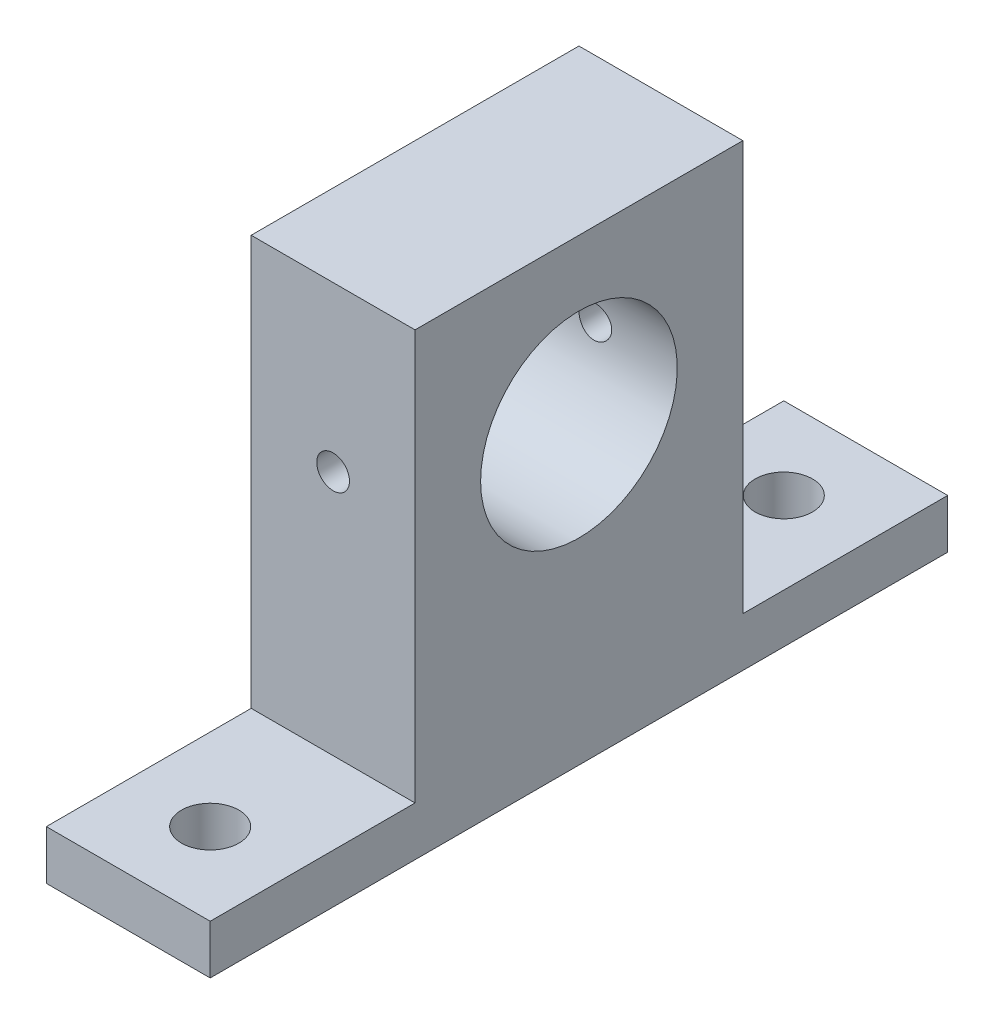
ISO-10303-21;
HEADER;
FILE_DESCRIPTION(('STEP AP214'),'2;1');
FILE_NAME('part.step','',(''),(''),'','','');
FILE_SCHEMA(('AUTOMOTIVE_DESIGN { 1 0 10303 214 1 1 1 1 }'));
ENDSEC;
DATA;
#1=APPLICATION_CONTEXT('core data for automotive mechanical design processes');
#2=APPLICATION_PROTOCOL_DEFINITION('international standard','automotive_design',2000,#1);
#3=PRODUCT_CONTEXT('',#1,'mechanical');
#4=PRODUCT('Part','Part','',(#3));
#5=PRODUCT_RELATED_PRODUCT_CATEGORY('part','',(#4));
#6=PRODUCT_DEFINITION_FORMATION('','',#4);
#7=PRODUCT_DEFINITION_CONTEXT('part definition',#1,'design');
#8=PRODUCT_DEFINITION('design','',#6,#7);
#9=PRODUCT_DEFINITION_SHAPE('','',#8);
#10=(LENGTH_UNIT() NAMED_UNIT(*) SI_UNIT(.MILLI.,.METRE.));
#11=(NAMED_UNIT(*) PLANE_ANGLE_UNIT() SI_UNIT($,.RADIAN.));
#12=(NAMED_UNIT(*) SI_UNIT($,.STERADIAN.) SOLID_ANGLE_UNIT());
#13=UNCERTAINTY_MEASURE_WITH_UNIT(LENGTH_MEASURE(1.E-05),#10,'distance_accuracy_value','');
#14=(GEOMETRIC_REPRESENTATION_CONTEXT(3) GLOBAL_UNCERTAINTY_ASSIGNED_CONTEXT((#13)) GLOBAL_UNIT_ASSIGNED_CONTEXT((#10,
#11,#12)) REPRESENTATION_CONTEXT('',''));
#15=CARTESIAN_POINT('',(0.,0.,0.));
#16=DIRECTION('',(0.,0.,1.));
#17=DIRECTION('',(1.,0.,0.));
#18=AXIS2_PLACEMENT_3D('',#15,#16,#17);
#19=CARTESIAN_POINT('',(0.,3.,0.));
#20=DIRECTION('',(0.,1.,0.));
#21=DIRECTION('',(0.,0.,1.));
#22=AXIS2_PLACEMENT_3D('',#19,#20,#21);
#23=PLANE('',#22);
#24=DIRECTION('',(1.,0.,0.));
#25=VECTOR('',#24,1.);
#26=CARTESIAN_POINT('',(-5.,3.,10.));
#27=LINE('',#26,#25);
#28=CARTESIAN_POINT('',(-5.,3.,9.99999999999999));
#29=VERTEX_POINT('',#28);
#30=CARTESIAN_POINT('',(5.,3.,9.99999999999999));
#31=VERTEX_POINT('',#30);
#32=EDGE_CURVE('E68',#29,#31,#27,.T.);
#33=ORIENTED_EDGE('',*,*,#32,.F.);
#34=DIRECTION('',(0.,0.,1.));
#35=VECTOR('',#34,1.);
#36=CARTESIAN_POINT('',(-5.,3.,-22.5));
#37=LINE('',#36,#35);
#38=CARTESIAN_POINT('',(-5.,3.,22.5));
#39=VERTEX_POINT('',#38);
#40=EDGE_CURVE('E173',#29,#39,#37,.T.);
#41=ORIENTED_EDGE('',*,*,#40,.T.);
#42=DIRECTION('',(1.,0.,0.));
#43=VECTOR('',#42,1.);
#44=CARTESIAN_POINT('',(-5.,3.,22.5));
#45=LINE('',#44,#43);
#46=CARTESIAN_POINT('',(5.,3.,22.5));
#47=VERTEX_POINT('',#46);
#48=EDGE_CURVE('E177',#39,#47,#45,.T.);
#49=ORIENTED_EDGE('',*,*,#48,.T.);
#50=DIRECTION('',(0.,0.,-1.));
#51=VECTOR('',#50,1.);
#52=CARTESIAN_POINT('',(5.,3.,-22.5));
#53=LINE('',#52,#51);
#54=EDGE_CURVE('E167',#47,#31,#53,.T.);
#55=ORIENTED_EDGE('',*,*,#54,.T.);
#56=EDGE_LOOP('',(#33,#41,#49,#55));
#57=FACE_BOUND('',#56,.T.);
#58=CARTESIAN_POINT('',(4.88807387438039E-13,3.,17.5));
#59=DIRECTION('',(0.,1.,0.));
#60=DIRECTION('',(0.,0.,1.));
#61=AXIS2_PLACEMENT_3D('',#58,#59,#60);
#62=CIRCLE('',#61,1.75);
#63=CARTESIAN_POINT('',(4.88807387438039E-13,3.,19.25));
#64=VERTEX_POINT('',#63);
#65=EDGE_CURVE('E149',#64,#64,#62,.T.);
#66=ORIENTED_EDGE('',*,*,#65,.F.);
#67=EDGE_LOOP('',(#66));
#68=FACE_BOUND('',#67,.T.);
#69=ADVANCED_FACE('F45',(#57,#68),#23,.T.);
#70=DIRECTION('',(-1.,0.,0.));
#71=VECTOR('',#70,1.);
#72=CARTESIAN_POINT('',(-5.,3.,-10.));
#73=LINE('',#72,#71);
#74=CARTESIAN_POINT('',(5.,3.,-10.));
#75=VERTEX_POINT('',#74);
#76=CARTESIAN_POINT('',(-5.,3.,-10.));
#77=VERTEX_POINT('',#76);
#78=EDGE_CURVE('E76',#75,#77,#73,.T.);
#79=ORIENTED_EDGE('',*,*,#78,.F.);
#80=CARTESIAN_POINT('',(5.,3.,-22.5));
#81=VERTEX_POINT('',#80);
#82=EDGE_CURVE('E142',#75,#81,#53,.T.);
#83=ORIENTED_EDGE('',*,*,#82,.T.);
#84=DIRECTION('',(-1.,0.,0.));
#85=VECTOR('',#84,1.);
#86=CARTESIAN_POINT('',(-5.,3.,-22.5));
#87=LINE('',#86,#85);
#88=CARTESIAN_POINT('',(-5.,3.,-22.5));
#89=VERTEX_POINT('',#88);
#90=EDGE_CURVE('E170',#81,#89,#87,.T.);
#91=ORIENTED_EDGE('',*,*,#90,.T.);
#92=EDGE_CURVE('E174',#89,#77,#37,.T.);
#93=ORIENTED_EDGE('',*,*,#92,.T.);
#94=EDGE_LOOP('',(#79,#83,#91,#93));
#95=FACE_BOUND('',#94,.T.);
#96=CARTESIAN_POINT('',(0.,3.,-17.5));
#97=DIRECTION('',(0.,1.,0.));
#98=DIRECTION('',(0.,0.,1.));
#99=AXIS2_PLACEMENT_3D('',#96,#97,#98);
#100=CIRCLE('',#99,1.75);
#101=CARTESIAN_POINT('',(0.,3.,-15.75));
#102=VERTEX_POINT('',#101);
#103=EDGE_CURVE('E159',#102,#102,#100,.T.);
#104=ORIENTED_EDGE('',*,*,#103,.F.);
#105=EDGE_LOOP('',(#104));
#106=FACE_BOUND('',#105,.T.);
#107=ADVANCED_FACE('F224',(#95,#106),#23,.T.);
#108=CARTESIAN_POINT('',(0.,0.,0.));
#109=DIRECTION('',(0.,1.,0.));
#110=DIRECTION('',(0.,0.,1.));
#111=AXIS2_PLACEMENT_3D('',#108,#109,#110);
#112=PLANE('',#111);
#113=DIRECTION('',(0.,0.,-1.));
#114=VECTOR('',#113,1.);
#115=CARTESIAN_POINT('',(5.,0.,-22.5));
#116=LINE('',#115,#114);
#117=CARTESIAN_POINT('',(5.,0.,22.5));
#118=VERTEX_POINT('',#117);
#119=CARTESIAN_POINT('',(5.,0.,-22.5));
#120=VERTEX_POINT('',#119);
#121=EDGE_CURVE('E163',#118,#120,#116,.T.);
#122=ORIENTED_EDGE('',*,*,#121,.F.);
#123=DIRECTION('',(1.,0.,0.));
#124=VECTOR('',#123,1.);
#125=CARTESIAN_POINT('',(-5.,0.,22.5));
#126=LINE('',#125,#124);
#127=CARTESIAN_POINT('',(-5.,0.,22.5));
#128=VERTEX_POINT('',#127);
#129=EDGE_CURVE('E189',#128,#118,#126,.T.);
#130=ORIENTED_EDGE('',*,*,#129,.F.);
#131=DIRECTION('',(0.,0.,1.));
#132=VECTOR('',#131,1.);
#133=CARTESIAN_POINT('',(-5.,0.,-22.5));
#134=LINE('',#133,#132);
#135=CARTESIAN_POINT('',(-5.,0.,-22.5));
#136=VERTEX_POINT('',#135);
#137=EDGE_CURVE('E186',#136,#128,#134,.T.);
#138=ORIENTED_EDGE('',*,*,#137,.F.);
#139=DIRECTION('',(-1.,0.,0.));
#140=VECTOR('',#139,1.);
#141=CARTESIAN_POINT('',(-5.,0.,-22.5));
#142=LINE('',#141,#140);
#143=EDGE_CURVE('E183',#120,#136,#142,.T.);
#144=ORIENTED_EDGE('',*,*,#143,.F.);
#145=EDGE_LOOP('',(#122,#130,#138,#144));
#146=FACE_BOUND('',#145,.T.);
#147=CARTESIAN_POINT('',(0.,0.,-17.5));
#148=DIRECTION('',(0.,1.,0.));
#149=DIRECTION('',(0.,0.,1.));
#150=AXIS2_PLACEMENT_3D('',#147,#148,#149);
#151=CIRCLE('',#150,1.75);
#152=CARTESIAN_POINT('',(0.,0.,-15.75));
#153=VERTEX_POINT('',#152);
#154=EDGE_CURVE('E157',#153,#153,#151,.T.);
#155=ORIENTED_EDGE('',*,*,#154,.T.);
#156=EDGE_LOOP('',(#155));
#157=FACE_BOUND('',#156,.T.);
#158=CARTESIAN_POINT('',(4.88807387438039E-13,0.,17.5));
#159=DIRECTION('',(0.,1.,0.));
#160=DIRECTION('',(0.,0.,1.));
#161=AXIS2_PLACEMENT_3D('',#158,#159,#160);
#162=CIRCLE('',#161,1.75);
#163=CARTESIAN_POINT('',(4.88807387438039E-13,0.,19.25));
#164=VERTEX_POINT('',#163);
#165=EDGE_CURVE('E144',#164,#164,#162,.T.);
#166=ORIENTED_EDGE('',*,*,#165,.T.);
#167=EDGE_LOOP('',(#166));
#168=FACE_BOUND('',#167,.T.);
#169=ADVANCED_FACE('F229',(#146,#157,#168),#112,.F.);
#170=CARTESIAN_POINT('',(5.,3.,-22.5));
#171=DIRECTION('',(-1.,0.,0.));
#172=DIRECTION('',(0.,0.,1.));
#173=AXIS2_PLACEMENT_3D('',#170,#171,#172);
#174=PLANE('',#173);
#175=CARTESIAN_POINT('',(5.,18.,0.));
#176=DIRECTION('',(-1.,0.,0.));
#177=DIRECTION('',(0.,0.,1.));
#178=AXIS2_PLACEMENT_3D('',#175,#176,#177);
#179=CIRCLE('',#178,6.);
#180=CARTESIAN_POINT('',(5.,18.,6.));
#181=VERTEX_POINT('',#180);
#182=EDGE_CURVE('E272',#181,#181,#179,.T.);
#183=ORIENTED_EDGE('',*,*,#182,.T.);
#184=EDGE_LOOP('',(#183));
#185=FACE_BOUND('',#184,.T.);
#186=ORIENTED_EDGE('',*,*,#121,.T.);
#187=DIRECTION('',(0.,-1.,0.));
#188=VECTOR('',#187,1.);
#189=CARTESIAN_POINT('',(5.,3.,-22.5));
#190=LINE('',#189,#188);
#191=EDGE_CURVE('E11',#81,#120,#190,.T.);
#192=ORIENTED_EDGE('',*,*,#191,.F.);
#193=ORIENTED_EDGE('',*,*,#82,.F.);
#194=DIRECTION('',(0.,-1.,0.));
#195=VECTOR('',#194,1.);
#196=CARTESIAN_POINT('',(5.,28.,-10.));
#197=LINE('',#196,#195);
#198=CARTESIAN_POINT('',(5.,28.,-10.));
#199=VERTEX_POINT('',#198);
#200=EDGE_CURVE('E122',#199,#75,#197,.T.);
#201=ORIENTED_EDGE('',*,*,#200,.F.);
#202=DIRECTION('',(0.,0.,-1.));
#203=VECTOR('',#202,1.);
#204=CARTESIAN_POINT('',(5.,28.,-10.));
#205=LINE('',#204,#203);
#206=CARTESIAN_POINT('',(5.,28.,10.));
#207=VERTEX_POINT('',#206);
#208=EDGE_CURVE('E129',#207,#199,#205,.T.);
#209=ORIENTED_EDGE('',*,*,#208,.F.);
#210=DIRECTION('',(0.,-1.,0.));
#211=VECTOR('',#210,1.);
#212=CARTESIAN_POINT('',(5.,28.,10.));
#213=LINE('',#212,#211);
#214=EDGE_CURVE('E264',#207,#31,#213,.T.);
#215=ORIENTED_EDGE('',*,*,#214,.T.);
#216=ORIENTED_EDGE('',*,*,#54,.F.);
#217=DIRECTION('',(0.,-1.,0.));
#218=VECTOR('',#217,1.);
#219=CARTESIAN_POINT('',(5.,3.,22.5));
#220=LINE('',#219,#218);
#221=EDGE_CURVE('E180',#47,#118,#220,.T.);
#222=ORIENTED_EDGE('',*,*,#221,.T.);
#223=EDGE_LOOP('',(#186,#192,#193,#201,#209,#215,#216,#222));
#224=FACE_BOUND('',#223,.T.);
#225=ADVANCED_FACE('F47',(#185,#224),#174,.F.);
#226=CARTESIAN_POINT('',(-5.,3.,-22.5));
#227=DIRECTION('',(0.,0.,1.));
#228=DIRECTION('',(1.,0.,0.));
#229=AXIS2_PLACEMENT_3D('',#226,#227,#228);
#230=PLANE('',#229);
#231=ORIENTED_EDGE('',*,*,#143,.T.);
#232=DIRECTION('',(0.,-1.,0.));
#233=VECTOR('',#232,1.);
#234=CARTESIAN_POINT('',(-5.,3.,-22.5));
#235=LINE('',#234,#233);
#236=EDGE_CURVE('E60',#89,#136,#235,.T.);
#237=ORIENTED_EDGE('',*,*,#236,.F.);
#238=ORIENTED_EDGE('',*,*,#90,.F.);
#239=ORIENTED_EDGE('',*,*,#191,.T.);
#240=EDGE_LOOP('',(#231,#237,#238,#239));
#241=FACE_BOUND('',#240,.T.);
#242=ADVANCED_FACE('F244',(#241),#230,.F.);
#243=CARTESIAN_POINT('',(-5.,3.,-22.5));
#244=DIRECTION('',(1.,0.,0.));
#245=DIRECTION('',(0.,0.,-1.));
#246=AXIS2_PLACEMENT_3D('',#243,#244,#245);
#247=PLANE('',#246);
#248=CARTESIAN_POINT('',(-5.,18.,0.));
#249=DIRECTION('',(-1.,0.,0.));
#250=DIRECTION('',(0.,0.,1.));
#251=AXIS2_PLACEMENT_3D('',#248,#249,#250);
#252=CIRCLE('',#251,6.);
#253=CARTESIAN_POINT('',(-5.,18.,6.));
#254=VERTEX_POINT('',#253);
#255=EDGE_CURVE('E282',#254,#254,#252,.T.);
#256=ORIENTED_EDGE('',*,*,#255,.F.);
#257=EDGE_LOOP('',(#256));
#258=FACE_BOUND('',#257,.T.);
#259=ORIENTED_EDGE('',*,*,#137,.T.);
#260=DIRECTION('',(0.,-1.,0.));
#261=VECTOR('',#260,1.);
#262=CARTESIAN_POINT('',(-5.,3.,22.5));
#263=LINE('',#262,#261);
#264=EDGE_CURVE('E195',#39,#128,#263,.T.);
#265=ORIENTED_EDGE('',*,*,#264,.F.);
#266=ORIENTED_EDGE('',*,*,#40,.F.);
#267=DIRECTION('',(0.,-1.,0.));
#268=VECTOR('',#267,1.);
#269=CARTESIAN_POINT('',(-5.,28.,10.));
#270=LINE('',#269,#268);
#271=CARTESIAN_POINT('',(-5.,28.,10.));
#272=VERTEX_POINT('',#271);
#273=EDGE_CURVE('E151',#272,#29,#270,.T.);
#274=ORIENTED_EDGE('',*,*,#273,.F.);
#275=DIRECTION('',(0.,0.,1.));
#276=VECTOR('',#275,1.);
#277=CARTESIAN_POINT('',(-5.,28.,-10.));
#278=LINE('',#277,#276);
#279=CARTESIAN_POINT('',(-5.,28.,-10.));
#280=VERTEX_POINT('',#279);
#281=EDGE_CURVE('E128',#280,#272,#278,.T.);
#282=ORIENTED_EDGE('',*,*,#281,.F.);
#283=DIRECTION('',(0.,-1.,0.));
#284=VECTOR('',#283,1.);
#285=CARTESIAN_POINT('',(-5.,28.,-10.));
#286=LINE('',#285,#284);
#287=EDGE_CURVE('E124',#280,#77,#286,.T.);
#288=ORIENTED_EDGE('',*,*,#287,.T.);
#289=ORIENTED_EDGE('',*,*,#92,.F.);
#290=ORIENTED_EDGE('',*,*,#236,.T.);
#291=EDGE_LOOP('',(#259,#265,#266,#274,#282,#288,#289,#290));
#292=FACE_BOUND('',#291,.T.);
#293=ADVANCED_FACE('F241',(#258,#292),#247,.F.);
#294=CARTESIAN_POINT('',(-5.,3.,22.5));
#295=DIRECTION('',(0.,0.,-1.));
#296=DIRECTION('',(-1.,0.,0.));
#297=AXIS2_PLACEMENT_3D('',#294,#295,#296);
#298=PLANE('',#297);
#299=ORIENTED_EDGE('',*,*,#129,.T.);
#300=ORIENTED_EDGE('',*,*,#221,.F.);
#301=ORIENTED_EDGE('',*,*,#48,.F.);
#302=ORIENTED_EDGE('',*,*,#264,.T.);
#303=EDGE_LOOP('',(#299,#300,#301,#302));
#304=FACE_BOUND('',#303,.T.);
#305=ADVANCED_FACE('F238',(#304),#298,.F.);
#306=CARTESIAN_POINT('',(0.,3.,-17.5));
#307=DIRECTION('',(0.,-1.,0.));
#308=DIRECTION('',(0.,0.,-1.));
#309=AXIS2_PLACEMENT_3D('',#306,#307,#308);
#310=CYLINDRICAL_SURFACE('',#309,1.75);
#311=ORIENTED_EDGE('',*,*,#103,.T.);
#312=EDGE_LOOP('',(#311));
#313=FACE_BOUND('',#312,.T.);
#314=ORIENTED_EDGE('',*,*,#154,.F.);
#315=EDGE_LOOP('',(#314));
#316=FACE_BOUND('',#315,.T.);
#317=ADVANCED_FACE('F233',(#313,#316),#310,.F.);
#318=CARTESIAN_POINT('',(4.88807387438039E-13,3.,17.5));
#319=DIRECTION('',(0.,-1.,0.));
#320=DIRECTION('',(0.,0.,-1.));
#321=AXIS2_PLACEMENT_3D('',#318,#319,#320);
#322=CYLINDRICAL_SURFACE('',#321,1.75);
#323=ORIENTED_EDGE('',*,*,#65,.T.);
#324=EDGE_LOOP('',(#323));
#325=FACE_BOUND('',#324,.T.);
#326=ORIENTED_EDGE('',*,*,#165,.F.);
#327=EDGE_LOOP('',(#326));
#328=FACE_BOUND('',#327,.T.);
#329=ADVANCED_FACE('F318',(#325,#328),#322,.F.);
#330=CARTESIAN_POINT('',(-5.,28.,-10.));
#331=DIRECTION('',(0.,0.,1.));
#332=DIRECTION('',(1.,0.,0.));
#333=AXIS2_PLACEMENT_3D('',#330,#331,#332);
#334=PLANE('',#333);
#335=CARTESIAN_POINT('',(0.,18.,-10.));
#336=DIRECTION('',(0.,0.,1.));
#337=DIRECTION('',(1.,0.,0.));
#338=AXIS2_PLACEMENT_3D('',#335,#336,#337);
#339=CIRCLE('',#338,1.);
#340=CARTESIAN_POINT('',(1.,18.,-10.));
#341=VERTEX_POINT('',#340);
#342=EDGE_CURVE('E207',#341,#341,#339,.T.);
#343=ORIENTED_EDGE('',*,*,#342,.T.);
#344=EDGE_LOOP('',(#343));
#345=FACE_BOUND('',#344,.T.);
#346=ORIENTED_EDGE('',*,*,#78,.T.);
#347=ORIENTED_EDGE('',*,*,#287,.F.);
#348=DIRECTION('',(-1.,0.,0.));
#349=VECTOR('',#348,1.);
#350=CARTESIAN_POINT('',(-5.,28.,-10.));
#351=LINE('',#350,#349);
#352=EDGE_CURVE('E118',#199,#280,#351,.T.);
#353=ORIENTED_EDGE('',*,*,#352,.F.);
#354=ORIENTED_EDGE('',*,*,#200,.T.);
#355=EDGE_LOOP('',(#346,#347,#353,#354));
#356=FACE_BOUND('',#355,.T.);
#357=ADVANCED_FACE('F120',(#345,#356),#334,.F.);
#358=CARTESIAN_POINT('',(-5.,28.,10.));
#359=DIRECTION('',(0.,0.,-1.));
#360=DIRECTION('',(-1.,0.,0.));
#361=AXIS2_PLACEMENT_3D('',#358,#359,#360);
#362=PLANE('',#361);
#363=CARTESIAN_POINT('',(0.,18.,10.));
#364=DIRECTION('',(0.,0.,1.));
#365=DIRECTION('',(1.,0.,0.));
#366=AXIS2_PLACEMENT_3D('',#363,#364,#365);
#367=CIRCLE('',#366,1.);
#368=CARTESIAN_POINT('',(1.,18.,10.));
#369=VERTEX_POINT('',#368);
#370=EDGE_CURVE('E289',#369,#369,#367,.T.);
#371=ORIENTED_EDGE('',*,*,#370,.F.);
#372=EDGE_LOOP('',(#371));
#373=FACE_BOUND('',#372,.T.);
#374=ORIENTED_EDGE('',*,*,#32,.T.);
#375=ORIENTED_EDGE('',*,*,#214,.F.);
#376=DIRECTION('',(1.,0.,0.));
#377=VECTOR('',#376,1.);
#378=CARTESIAN_POINT('',(-5.,28.,10.));
#379=LINE('',#378,#377);
#380=EDGE_CURVE('E134',#272,#207,#379,.T.);
#381=ORIENTED_EDGE('',*,*,#380,.F.);
#382=ORIENTED_EDGE('',*,*,#273,.T.);
#383=EDGE_LOOP('',(#374,#375,#381,#382));
#384=FACE_BOUND('',#383,.T.);
#385=ADVANCED_FACE('F267',(#373,#384),#362,.F.);
#386=CARTESIAN_POINT('',(0.,28.,0.));
#387=DIRECTION('',(0.,1.,0.));
#388=DIRECTION('',(0.,0.,1.));
#389=AXIS2_PLACEMENT_3D('',#386,#387,#388);
#390=PLANE('',#389);
#391=ORIENTED_EDGE('',*,*,#208,.T.);
#392=ORIENTED_EDGE('',*,*,#352,.T.);
#393=ORIENTED_EDGE('',*,*,#281,.T.);
#394=ORIENTED_EDGE('',*,*,#380,.T.);
#395=EDGE_LOOP('',(#391,#392,#393,#394));
#396=FACE_BOUND('',#395,.T.);
#397=ADVANCED_FACE('F132',(#396),#390,.T.);
#398=CARTESIAN_POINT('',(5.,18.,0.));
#399=DIRECTION('',(-1.,0.,0.));
#400=DIRECTION('',(0.,0.,1.));
#401=AXIS2_PLACEMENT_3D('',#398,#399,#400);
#402=CYLINDRICAL_SURFACE('',#401,6.);
#403=CARTESIAN_POINT('',(1.,18.,6.));
#404=CARTESIAN_POINT('',(0.999997764420874,18.0557563619833,5.9999990446753));
#405=CARTESIAN_POINT('',(0.995321090012433,18.1115431527355,5.99921471165214));
#406=CARTESIAN_POINT('',(0.976745736493871,18.2215520886692,5.99616137976555));
#407=CARTESIAN_POINT('',(0.962838577235359,18.2757727471837,5.99389101569556));
#408=CARTESIAN_POINT('',(0.926233820562898,18.3810418988851,5.9881202729458));
#409=CARTESIAN_POINT('',(0.90354341374377,18.4320929473728,5.98462090063677));
#410=CARTESIAN_POINT('',(0.850035083179042,18.5296567367912,5.97677690832828));
#411=CARTESIAN_POINT('',(0.819218089006802,18.5761699959514,5.97243238501774));
#412=CARTESIAN_POINT('',(0.750017966471818,18.6637890457167,5.96333326983325));
#413=CARTESIAN_POINT('',(0.71157235414555,18.704845161414,5.95857548725943));
#414=CARTESIAN_POINT('',(0.628340812610877,18.779955399464,5.94921050750693));
#415=CARTESIAN_POINT('',(0.583554483417357,18.8140090797564,5.94460331985067));
#416=CARTESIAN_POINT('',(0.488571613521179,18.8743468502421,5.93603026303912));
#417=CARTESIAN_POINT('',(0.438343465278098,18.9005818211444,5.93206851636654));
#418=CARTESIAN_POINT('',(0.33411617427975,18.9442233461645,5.9252791591787));
#419=CARTESIAN_POINT('',(0.280117286528948,18.9616304966262,5.92245147205723));
#420=CARTESIAN_POINT('',(0.170407890057385,18.9869657511139,5.91828214737102));
#421=CARTESIAN_POINT('',(0.114717705399443,18.9949796116542,5.9169270739428));
#422=CARTESIAN_POINT('',(0.00276788924661112,19.001566690116,5.9158157557466));
#423=CARTESIAN_POINT('',(-0.0534917016669202,19.0001405761556,5.91605939782886));
#424=CARTESIAN_POINT('',(-0.16437114451018,18.9879580393585,5.91810571545422));
#425=CARTESIAN_POINT('',(-0.219001921418094,18.9772979527559,5.91989229327567));
#426=CARTESIAN_POINT('',(-0.325688527131654,18.9471012561614,5.92479798084403));
#427=CARTESIAN_POINT('',(-0.377744267555419,18.9275643417279,5.92791713629309));
#428=CARTESIAN_POINT('',(-0.478091529376368,18.8800708984376,5.9351539173364));
#429=CARTESIAN_POINT('',(-0.526363762432492,18.8520743655519,5.9392762684293));
#430=CARTESIAN_POINT('',(-0.617561760215356,18.788484807023,5.94805167366004));
#431=CARTESIAN_POINT('',(-0.660487092981974,18.7528911682617,5.95270477061715));
#432=CARTESIAN_POINT('',(-0.740330434322939,18.6745928848636,5.96208811151914));
#433=CARTESIAN_POINT('',(-0.777167407416033,18.6318055855493,5.96681859692661));
#434=CARTESIAN_POINT('',(-0.843151105066137,18.5406140995927,5.97577040558689));
#435=CARTESIAN_POINT('',(-0.872297780073292,18.4922098767626,5.97999172555898));
#436=CARTESIAN_POINT('',(-0.922080890854514,18.3910823664667,5.98745557157165));
#437=CARTESIAN_POINT('',(-0.942710167732504,18.3383554902259,5.99069727362979));
#438=CARTESIAN_POINT('',(-0.974797686098393,18.2301193382411,5.99583001205064));
#439=CARTESIAN_POINT('',(-0.986256694789488,18.1746102956718,5.9977211614019));
#440=CARTESIAN_POINT('',(-0.999568543384455,18.0630839605207,5.99992451937074));
#441=CARTESIAN_POINT('',(-1.00153262872224,18.0070802948604,6.00025501205114));
#442=CARTESIAN_POINT('',(-0.996095462228751,17.895544090844,5.99934989768468));
#443=CARTESIAN_POINT('',(-0.988694570746506,17.8400115344432,5.99811435089647));
#444=CARTESIAN_POINT('',(-0.964830060265809,17.7313375297813,5.99422730775281));
#445=CARTESIAN_POINT('',(-0.94842151664395,17.6781836526458,5.99158441920524));
#446=CARTESIAN_POINT('',(-0.907066192720187,17.5753812460558,5.98517785782144));
#447=CARTESIAN_POINT('',(-0.882118932945892,17.5257329136361,5.98141412204808));
#448=CARTESIAN_POINT('',(-0.824139550121286,17.4308677242124,5.97313806520963));
#449=CARTESIAN_POINT('',(-0.7910379375331,17.3856938996251,5.96861942354809));
#450=CARTESIAN_POINT('',(-0.717785073845977,17.3015025657989,5.9593538695676));
#451=CARTESIAN_POINT('',(-0.677633310689332,17.2624855041214,5.95460694068619));
#452=CARTESIAN_POINT('',(-0.590920980771429,17.1913028881368,5.94536070094338));
#453=CARTESIAN_POINT('',(-0.544298333794235,17.1592124955545,5.94086446454843));
#454=CARTESIAN_POINT('',(-0.446258812344583,17.103319075882,5.93268611911154));
#455=CARTESIAN_POINT('',(-0.394842089909001,17.0795157860921,5.92900398426408));
#456=CARTESIAN_POINT('',(-0.288884106875147,17.0409846674107,5.92289381479082));
#457=CARTESIAN_POINT('',(-0.234356761987804,17.0262194269808,5.92046061724426));
#458=CARTESIAN_POINT('',(-0.123551948311295,17.0060658184887,5.91711086734104));
#459=CARTESIAN_POINT('',(-0.0672746321071792,17.0006766352215,5.91619418313089));
#460=CARTESIAN_POINT('',(0.0446820663849639,16.9994508535811,5.91598693233605));
#461=CARTESIAN_POINT('',(0.100360151430116,17.0034959455499,5.9166762260226));
#462=CARTESIAN_POINT('',(0.210231699220307,17.0207680644173,5.91955912581491));
#463=CARTESIAN_POINT('',(0.26442516677675,17.033995061555,5.92175272704486));
#464=CARTESIAN_POINT('',(0.369743374917046,17.069210204162,5.92738942512688));
#465=CARTESIAN_POINT('',(0.42087160402241,17.0911881637598,5.93083106887868));
#466=CARTESIAN_POINT('',(0.518734267677939,17.1432691984336,5.93857747568883));
#467=CARTESIAN_POINT('',(0.565468484148854,17.1733726765006,5.9428822815536));
#468=CARTESIAN_POINT('',(0.653814233243102,17.2412724462511,5.95193381618249));
#469=CARTESIAN_POINT('',(0.69535840668011,17.2791557745625,5.95668518230521));
#470=CARTESIAN_POINT('',(0.771540641789975,17.3613563874479,5.96605748944336));
#471=CARTESIAN_POINT('',(0.806177107455269,17.4056751548349,5.97067840010619));
#472=CARTESIAN_POINT('',(0.867779307279979,17.4998523321439,5.97930611856888));
#473=CARTESIAN_POINT('',(0.894690415725181,17.5497468849869,5.98330846501242));
#474=CARTESIAN_POINT('',(0.939707793843969,17.6533947722484,5.9902046704071));
#475=CARTESIAN_POINT('',(0.95782283243188,17.707144202068,5.99309963270993));
#476=CARTESIAN_POINT('',(0.980802109650667,17.8009186759818,5.99682316333182));
#477=CARTESIAN_POINT('',(0.987989787846386,17.8403764678806,5.99800810909344));
#478=CARTESIAN_POINT('',(0.997589495137901,17.9198842758721,5.99959686394448));
#479=CARTESIAN_POINT('',(1.00000160645495,17.9599342817566,6.00000068648257));
#480=CARTESIAN_POINT('',(1.,18.,6.));
#481=B_SPLINE_CURVE_WITH_KNOTS('',3,(#403,#404,#405,#406,#407,#408,#409,#410,#411,#412,#413,
#414,#415,#416,#417,#418,#419,#420,#421,#422,#423,#424,#425,#426,#427,#428,#429,#430,#431,#432,
#433,#434,#435,#436,#437,#438,#439,#440,#441,#442,#443,#444,#445,#446,#447,#448,#449,#450,#451,
#452,#453,#454,#455,#456,#457,#458,#459,#460,#461,#462,#463,#464,#465,#466,#467,#468,#469,#470,
#471,#472,#473,#474,#475,#476,#477,#478,#479,#480),.UNSPECIFIED.,.T.,.F.,(4,2,2,2,2,2,2,2,2,2,2,
2,2,2,2,2,2,2,2,2,2,2,2,2,2,2,2,2,2,2,2,2,2,2,2,2,2,2,4),(0.,0.167122633975403,
0.334399018278169,0.50153874681011,0.668659365069916,0.837209964249327,1.00577120067943,
1.17537008329536,1.34495750750473,1.5129843084137,1.68099921728355,1.84728208704164,
2.01357066010153,2.18065822653023,2.3477592827223,2.51693107964531,2.68610396654339,
2.85541875566362,3.0247193780846,3.19203153396559,3.35933725214344,3.52563122802566,
3.69193454330427,3.8597073025081,4.02749225221714,4.19701528803048,4.36653294950378,
4.53534408936709,4.70414055114647,4.87083163809081,5.03752218475254,5.2040192729049,
5.37052462011735,5.53900553677357,5.7075253355159,5.8772089264288,6.04672300852029,
6.16681699265608,6.28690890910788),.UNSPECIFIED.);
#482=CARTESIAN_POINT('',(1.,18.,6.));
#483=VERTEX_POINT('',#482);
#484=EDGE_CURVE('E49',#483,#483,#481,.T.);
#485=ORIENTED_EDGE('',*,*,#484,.T.);
#486=EDGE_LOOP('',(#485));
#487=FACE_BOUND('',#486,.T.);
#488=CARTESIAN_POINT('',(1.,18.,-6.));
#489=CARTESIAN_POINT('',(0.999997764420874,17.9442436380167,-5.9999990446753));
#490=CARTESIAN_POINT('',(0.995321090012433,17.8884568472645,-5.99921471165214));
#491=CARTESIAN_POINT('',(0.976745736493871,17.7784479113308,-5.99616137976555));
#492=CARTESIAN_POINT('',(0.962838577235359,17.7242272528163,-5.99389101569556));
#493=CARTESIAN_POINT('',(0.926233820562898,17.6189581011149,-5.9881202729458));
#494=CARTESIAN_POINT('',(0.90354341374377,17.5679070526272,-5.98462090063677));
#495=CARTESIAN_POINT('',(0.850035083179041,17.4703432632088,-5.97677690832828));
#496=CARTESIAN_POINT('',(0.819218089006801,17.4238300040486,-5.97243238501774));
#497=CARTESIAN_POINT('',(0.750017966471818,17.3362109542833,-5.96333326983325));
#498=CARTESIAN_POINT('',(0.71157235414555,17.295154838586,-5.95857548725943));
#499=CARTESIAN_POINT('',(0.628340812610877,17.220044600536,-5.94921050750693));
#500=CARTESIAN_POINT('',(0.583554483417357,17.1859909202436,-5.94460331985067));
#501=CARTESIAN_POINT('',(0.488571613521179,17.125653149758,-5.93603026303912));
#502=CARTESIAN_POINT('',(0.438343465278098,17.0994181788556,-5.93206851636655));
#503=CARTESIAN_POINT('',(0.33411617427975,17.0557766538355,-5.9252791591787));
#504=CARTESIAN_POINT('',(0.280117286528948,17.0383695033738,-5.92245147205723));
#505=CARTESIAN_POINT('',(0.170407890057385,17.0130342488861,-5.91828214737102));
#506=CARTESIAN_POINT('',(0.114717705399443,17.0050203883458,-5.9169270739428));
#507=CARTESIAN_POINT('',(0.00276788924661149,16.998433309884,-5.9158157557466));
#508=CARTESIAN_POINT('',(-0.05349170166692,16.9998594238444,-5.91605939782886));
#509=CARTESIAN_POINT('',(-0.16437114451018,17.0120419606415,-5.91810571545422));
#510=CARTESIAN_POINT('',(-0.219001921418093,17.0227020472441,-5.91989229327567));
#511=CARTESIAN_POINT('',(-0.325688527131653,17.0528987438386,-5.92479798084403));
#512=CARTESIAN_POINT('',(-0.377744267555419,17.0724356582721,-5.92791713629309));
#513=CARTESIAN_POINT('',(-0.478091529376368,17.1199291015624,-5.9351539173364));
#514=CARTESIAN_POINT('',(-0.526363762432491,17.1479256344481,-5.9392762684293));
#515=CARTESIAN_POINT('',(-0.617561760215353,17.211515192977,-5.94805167366003));
#516=CARTESIAN_POINT('',(-0.660487092981973,17.2471088317383,-5.95270477061714));
#517=CARTESIAN_POINT('',(-0.740330434322938,17.3254071151364,-5.96208811151914));
#518=CARTESIAN_POINT('',(-0.777167407416033,17.3681944144508,-5.96681859692661));
#519=CARTESIAN_POINT('',(-0.843151105066136,17.4593859004073,-5.97577040558689));
#520=CARTESIAN_POINT('',(-0.872297780073292,17.5077901232374,-5.97999172555898));
#521=CARTESIAN_POINT('',(-0.922080890854514,17.6089176335333,-5.98745557157165));
#522=CARTESIAN_POINT('',(-0.942710167732504,17.6616445097741,-5.99069727362979));
#523=CARTESIAN_POINT('',(-0.974797686098392,17.7698806617589,-5.99583001205064));
#524=CARTESIAN_POINT('',(-0.986256694789488,17.8253897043282,-5.9977211614019));
#525=CARTESIAN_POINT('',(-0.999568543384455,17.9369160394794,-5.99992451937074));
#526=CARTESIAN_POINT('',(-1.00153262872224,17.9929197051396,-6.00025501205114));
#527=CARTESIAN_POINT('',(-0.996095462228751,18.104455909156,-5.99934989768468));
#528=CARTESIAN_POINT('',(-0.988694570746506,18.1599884655568,-5.99811435089647));
#529=CARTESIAN_POINT('',(-0.964830060265809,18.2686624702187,-5.99422730775281));
#530=CARTESIAN_POINT('',(-0.94842151664395,18.3218163473542,-5.99158441920524));
#531=CARTESIAN_POINT('',(-0.907066192720187,18.4246187539442,-5.98517785782144));
#532=CARTESIAN_POINT('',(-0.882118932945892,18.4742670863639,-5.98141412204808));
#533=CARTESIAN_POINT('',(-0.824139550121286,18.5691322757876,-5.97313806520963));
#534=CARTESIAN_POINT('',(-0.7910379375331,18.6143061003749,-5.96861942354809));
#535=CARTESIAN_POINT('',(-0.717785073845977,18.6984974342011,-5.9593538695676));
#536=CARTESIAN_POINT('',(-0.677633310689332,18.7375144958786,-5.95460694068619));
#537=CARTESIAN_POINT('',(-0.59092098077143,18.8086971118632,-5.94536070094338));
#538=CARTESIAN_POINT('',(-0.544298333794235,18.8407875044455,-5.94086446454843));
#539=CARTESIAN_POINT('',(-0.446258812344584,18.896680924118,-5.93268611911154));
#540=CARTESIAN_POINT('',(-0.394842089909001,18.9204842139079,-5.92900398426408));
#541=CARTESIAN_POINT('',(-0.288884106875147,18.9590153325893,-5.92289381479082));
#542=CARTESIAN_POINT('',(-0.234356761987805,18.9737805730192,-5.92046061724426));
#543=CARTESIAN_POINT('',(-0.123551948311296,18.9939341815113,-5.91711086734104));
#544=CARTESIAN_POINT('',(-0.0672746321071798,18.9993233647785,-5.91619418313089));
#545=CARTESIAN_POINT('',(0.0446820663849632,19.0005491464189,-5.91598693233605));
#546=CARTESIAN_POINT('',(0.100360151430115,18.9965040544501,-5.9166762260226));
#547=CARTESIAN_POINT('',(0.210231699220306,18.9792319355827,-5.91955912581491));
#548=CARTESIAN_POINT('',(0.264425166776749,18.966004938445,-5.92175272704486));
#549=CARTESIAN_POINT('',(0.369743374917045,18.930789795838,-5.92738942512688));
#550=CARTESIAN_POINT('',(0.420871604022409,18.9088118362402,-5.93083106887868));
#551=CARTESIAN_POINT('',(0.518734267677938,18.8567308015664,-5.93857747568883));
#552=CARTESIAN_POINT('',(0.565468484148853,18.8266273234994,-5.9428822815536));
#553=CARTESIAN_POINT('',(0.653814233243102,18.7587275537489,-5.95193381618249));
#554=CARTESIAN_POINT('',(0.695358406680109,18.7208442254375,-5.95668518230521));
#555=CARTESIAN_POINT('',(0.771540641789975,18.6386436125521,-5.96605748944337));
#556=CARTESIAN_POINT('',(0.806177107455268,18.5943248451651,-5.97067840010619));
#557=CARTESIAN_POINT('',(0.867779307279978,18.5001476678561,-5.97930611856888));
#558=CARTESIAN_POINT('',(0.89469041572518,18.4502531150131,-5.98330846501242));
#559=CARTESIAN_POINT('',(0.939707793843968,18.3466052277516,-5.9902046704071));
#560=CARTESIAN_POINT('',(0.957822832431879,18.292855797932,-5.99309963270993));
#561=CARTESIAN_POINT('',(0.980802109650667,18.1990813240182,-5.99682316333182));
#562=CARTESIAN_POINT('',(0.987989787846386,18.1596235321194,-5.99800810909344));
#563=CARTESIAN_POINT('',(0.997589495137901,18.0801157241279,-5.99959686394449));
#564=CARTESIAN_POINT('',(1.00000160645495,18.0400657182434,-6.00000068648257));
#565=CARTESIAN_POINT('',(1.,18.,-6.));
#566=B_SPLINE_CURVE_WITH_KNOTS('',3,(#488,#489,#490,#491,#492,#493,#494,#495,#496,#497,#498,
#499,#500,#501,#502,#503,#504,#505,#506,#507,#508,#509,#510,#511,#512,#513,#514,#515,#516,#517,
#518,#519,#520,#521,#522,#523,#524,#525,#526,#527,#528,#529,#530,#531,#532,#533,#534,#535,#536,
#537,#538,#539,#540,#541,#542,#543,#544,#545,#546,#547,#548,#549,#550,#551,#552,#553,#554,#555,
#556,#557,#558,#559,#560,#561,#562,#563,#564,#565),.UNSPECIFIED.,.T.,.F.,(4,2,2,2,2,2,2,2,2,2,2,
2,2,2,2,2,2,2,2,2,2,2,2,2,2,2,2,2,2,2,2,2,2,2,2,2,2,2,4),(0.,0.167122633975403,
0.334399018278169,0.501538746810113,0.668659365069916,0.837209964249327,1.00577120067943,
1.17537008329536,1.34495750750473,1.5129843084137,1.68099921728355,1.84728208704164,
2.01357066010153,2.18065822653023,2.3477592827223,2.51693107964531,2.68610396654339,
2.85541875566362,3.0247193780846,3.19203153396559,3.35933725214344,3.52563122802567,
3.69193454330427,3.8597073025081,4.02749225221714,4.19701528803048,4.36653294950378,
4.53534408936709,4.70414055114647,4.8708316380908,5.03752218475254,5.20401927290489,
5.37052462011735,5.53900553677357,5.70752533551589,5.8772089264288,6.04672300852029,
6.16681699265608,6.28690890910788),.UNSPECIFIED.);
#567=CARTESIAN_POINT('',(1.,18.,-6.));
#568=VERTEX_POINT('',#567);
#569=EDGE_CURVE('E201',#568,#568,#566,.T.);
#570=ORIENTED_EDGE('',*,*,#569,.T.);
#571=EDGE_LOOP('',(#570));
#572=FACE_BOUND('',#571,.T.);
#573=ORIENTED_EDGE('',*,*,#182,.F.);
#574=EDGE_LOOP('',(#573));
#575=FACE_BOUND('',#574,.T.);
#576=ORIENTED_EDGE('',*,*,#255,.T.);
#577=EDGE_LOOP('',(#576));
#578=FACE_BOUND('',#577,.T.);
#579=ADVANCED_FACE('F208',(#487,#572,#575,#578),#402,.F.);
#580=CARTESIAN_POINT('',(0.,18.,-10.));
#581=DIRECTION('',(0.,0.,1.));
#582=DIRECTION('',(1.,0.,0.));
#583=AXIS2_PLACEMENT_3D('',#580,#581,#582);
#584=CYLINDRICAL_SURFACE('',#583,1.);
#585=ORIENTED_EDGE('',*,*,#342,.F.);
#586=EDGE_LOOP('',(#585));
#587=FACE_BOUND('',#586,.T.);
#588=ORIENTED_EDGE('',*,*,#569,.F.);
#589=EDGE_LOOP('',(#588));
#590=FACE_BOUND('',#589,.T.);
#591=ADVANCED_FACE('F214',(#587,#590),#584,.F.);
#592=ORIENTED_EDGE('',*,*,#370,.T.);
#593=EDGE_LOOP('',(#592));
#594=FACE_BOUND('',#593,.T.);
#595=ORIENTED_EDGE('',*,*,#484,.F.);
#596=EDGE_LOOP('',(#595));
#597=FACE_BOUND('',#596,.T.);
#598=ADVANCED_FACE('F211',(#594,#597),#584,.F.);
#599=CLOSED_SHELL('',(#69,#107,#169,#225,#242,#293,#305,#317,#329,#357,#385,#397,#579,#591,#598));
#600=MANIFOLD_SOLID_BREP('B2',#599);
#601=ADVANCED_BREP_SHAPE_REPRESENTATION('',(#18,#600),#14);
#602=SHAPE_DEFINITION_REPRESENTATION(#9,#601);
ENDSEC;
END-ISO-10303-21;
